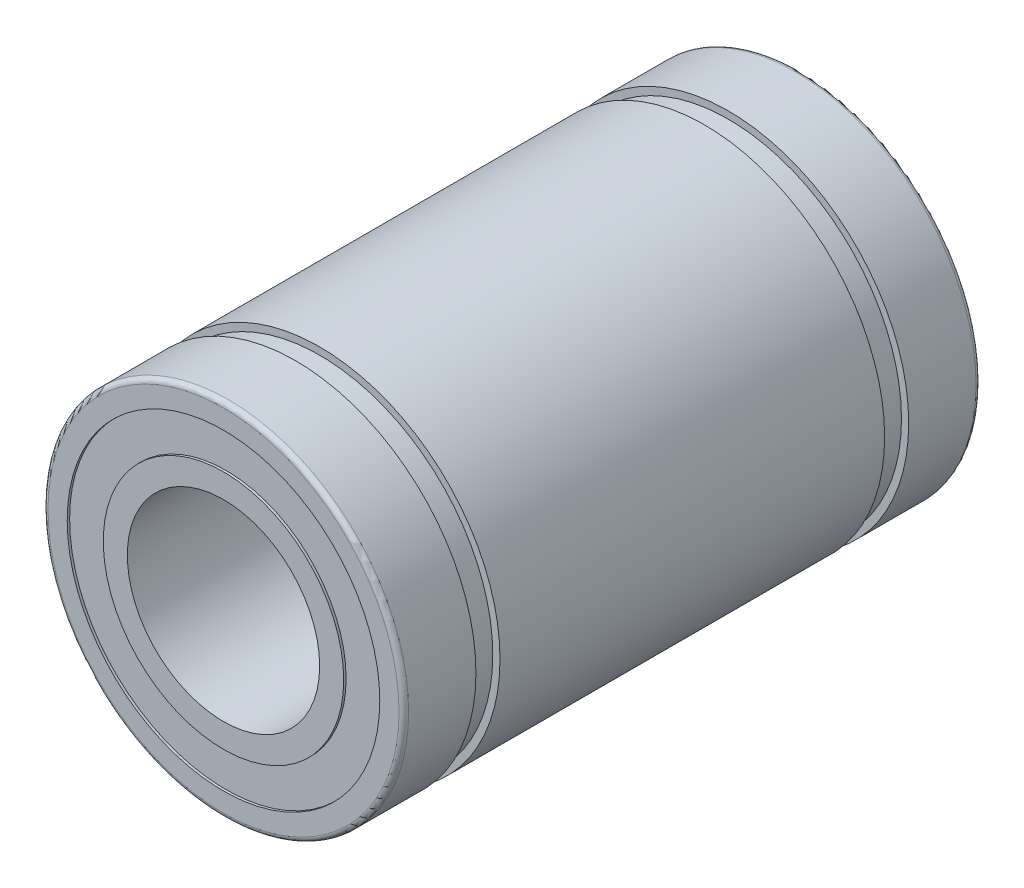
ISO-10303-21;
HEADER;
FILE_DESCRIPTION(('STEP AP214'),'2;1');
FILE_NAME('part.step','',(''),(''),'','','');
FILE_SCHEMA(('AUTOMOTIVE_DESIGN { 1 0 10303 214 1 1 1 1 }'));
ENDSEC;
DATA;
#1=APPLICATION_CONTEXT('core data for automotive mechanical design processes');
#2=APPLICATION_PROTOCOL_DEFINITION('international standard','automotive_design',2000,#1);
#3=PRODUCT_CONTEXT('',#1,'mechanical');
#4=PRODUCT('Part','Part','',(#3));
#5=PRODUCT_RELATED_PRODUCT_CATEGORY('part','',(#4));
#6=PRODUCT_DEFINITION_FORMATION('','',#4);
#7=PRODUCT_DEFINITION_CONTEXT('part definition',#1,'design');
#8=PRODUCT_DEFINITION('design','',#6,#7);
#9=PRODUCT_DEFINITION_SHAPE('','',#8);
#10=(LENGTH_UNIT() NAMED_UNIT(*) SI_UNIT(.MILLI.,.METRE.));
#11=(NAMED_UNIT(*) PLANE_ANGLE_UNIT() SI_UNIT($,.RADIAN.));
#12=(NAMED_UNIT(*) SI_UNIT($,.STERADIAN.) SOLID_ANGLE_UNIT());
#13=UNCERTAINTY_MEASURE_WITH_UNIT(LENGTH_MEASURE(1.E-05),#10,'distance_accuracy_value','');
#14=(GEOMETRIC_REPRESENTATION_CONTEXT(3) GLOBAL_UNCERTAINTY_ASSIGNED_CONTEXT((#13)) GLOBAL_UNIT_ASSIGNED_CONTEXT((#10,
#11,#12)) REPRESENTATION_CONTEXT('',''));
#15=CARTESIAN_POINT('',(0.,0.,0.));
#16=DIRECTION('',(0.,0.,1.));
#17=DIRECTION('',(1.,0.,0.));
#18=AXIS2_PLACEMENT_3D('',#15,#16,#17);
#19=CARTESIAN_POINT('',(0.,0.,0.));
#20=DIRECTION('',(0.,0.,1.));
#21=DIRECTION('',(1.,0.,0.));
#22=AXIS2_PLACEMENT_3D('',#19,#20,#21);
#23=CYLINDRICAL_SURFACE('',#22,7.5);
#24=CARTESIAN_POINT('',(0.,0.,-0.2));
#25=DIRECTION('',(0.,0.,-1.));
#26=DIRECTION('',(-1.,0.,0.));
#27=AXIS2_PLACEMENT_3D('',#24,#25,#26);
#28=CIRCLE('',#27,7.5);
#29=CARTESIAN_POINT('',(-7.5,0.,-0.2));
#30=VERTEX_POINT('',#29);
#31=EDGE_CURVE('E10',#30,#30,#28,.T.);
#32=ORIENTED_EDGE('',*,*,#31,.T.);
#33=EDGE_LOOP('',(#32));
#34=FACE_BOUND('',#33,.T.);
#35=CARTESIAN_POINT('',(0.,0.,-3.));
#36=DIRECTION('',(0.,0.,1.));
#37=DIRECTION('',(1.,0.,0.));
#38=AXIS2_PLACEMENT_3D('',#35,#36,#37);
#39=CIRCLE('',#38,7.5);
#40=CARTESIAN_POINT('',(7.5,0.,-3.));
#41=VERTEX_POINT('',#40);
#42=EDGE_CURVE('E140',#41,#41,#39,.T.);
#43=ORIENTED_EDGE('',*,*,#42,.T.);
#44=EDGE_LOOP('',(#43));
#45=FACE_BOUND('',#44,.T.);
#46=ADVANCED_FACE('F48',(#34,#45),#23,.T.);
#47=CARTESIAN_POINT('',(0.,7.5,0.));
#48=DIRECTION('',(0.,0.,-1.));
#49=DIRECTION('',(-1.,0.,0.));
#50=AXIS2_PLACEMENT_3D('',#47,#48,#49);
#51=PLANE('',#50);
#52=CARTESIAN_POINT('',(0.,0.,0.));
#53=DIRECTION('',(0.,0.,-1.));
#54=DIRECTION('',(-1.,0.,0.));
#55=AXIS2_PLACEMENT_3D('',#52,#53,#54);
#56=CIRCLE('',#55,7.3);
#57=CARTESIAN_POINT('',(-7.3,0.,0.));
#58=VERTEX_POINT('',#57);
#59=EDGE_CURVE('E56',#58,#58,#56,.F.);
#60=ORIENTED_EDGE('',*,*,#59,.T.);
#61=EDGE_LOOP('',(#60));
#62=FACE_BOUND('',#61,.T.);
#63=CARTESIAN_POINT('',(0.,0.,0.));
#64=DIRECTION('',(0.,0.,1.));
#65=DIRECTION('',(1.,0.,0.));
#66=AXIS2_PLACEMENT_3D('',#63,#64,#65);
#67=CIRCLE('',#66,6.5);
#68=CARTESIAN_POINT('',(6.5,0.,0.));
#69=VERTEX_POINT('',#68);
#70=EDGE_CURVE('E72',#69,#69,#67,.T.);
#71=ORIENTED_EDGE('',*,*,#70,.F.);
#72=EDGE_LOOP('',(#71));
#73=FACE_BOUND('',#72,.T.);
#74=ADVANCED_FACE('F202',(#62,#73),#51,.F.);
#75=CARTESIAN_POINT('',(0.,0.,0.));
#76=DIRECTION('',(0.,0.,1.));
#77=DIRECTION('',(1.,0.,0.));
#78=AXIS2_PLACEMENT_3D('',#75,#76,#77);
#79=CYLINDRICAL_SURFACE('',#78,6.5);
#80=CARTESIAN_POINT('',(0.,0.,-0.1));
#81=DIRECTION('',(0.,0.,1.));
#82=DIRECTION('',(1.,0.,0.));
#83=AXIS2_PLACEMENT_3D('',#80,#81,#82);
#84=CIRCLE('',#83,6.5);
#85=CARTESIAN_POINT('',(6.5,0.,-0.1));
#86=VERTEX_POINT('',#85);
#87=EDGE_CURVE('E76',#86,#86,#84,.T.);
#88=ORIENTED_EDGE('',*,*,#87,.F.);
#89=EDGE_LOOP('',(#88));
#90=FACE_BOUND('',#89,.T.);
#91=ORIENTED_EDGE('',*,*,#70,.T.);
#92=EDGE_LOOP('',(#91));
#93=FACE_BOUND('',#92,.T.);
#94=ADVANCED_FACE('F207',(#90,#93),#79,.F.);
#95=CARTESIAN_POINT('',(0.,6.5,-0.1));
#96=DIRECTION('',(0.,0.,-1.));
#97=DIRECTION('',(-1.,0.,0.));
#98=AXIS2_PLACEMENT_3D('',#95,#96,#97);
#99=PLANE('',#98);
#100=CARTESIAN_POINT('',(0.,0.,-0.1));
#101=DIRECTION('',(0.,0.,1.));
#102=DIRECTION('',(1.,0.,0.));
#103=AXIS2_PLACEMENT_3D('',#100,#101,#102);
#104=CIRCLE('',#103,5.);
#105=CARTESIAN_POINT('',(5.,0.,-0.1));
#106=VERTEX_POINT('',#105);
#107=EDGE_CURVE('E80',#106,#106,#104,.T.);
#108=ORIENTED_EDGE('',*,*,#107,.F.);
#109=EDGE_LOOP('',(#108));
#110=FACE_BOUND('',#109,.T.);
#111=ORIENTED_EDGE('',*,*,#87,.T.);
#112=EDGE_LOOP('',(#111));
#113=FACE_BOUND('',#112,.T.);
#114=ADVANCED_FACE('F259',(#110,#113),#99,.F.);
#115=CARTESIAN_POINT('',(0.,0.,0.));
#116=DIRECTION('',(0.,0.,1.));
#117=DIRECTION('',(1.,0.,0.));
#118=AXIS2_PLACEMENT_3D('',#115,#116,#117);
#119=CYLINDRICAL_SURFACE('',#118,5.);
#120=CARTESIAN_POINT('',(0.,0.,0.));
#121=DIRECTION('',(0.,0.,1.));
#122=DIRECTION('',(1.,0.,0.));
#123=AXIS2_PLACEMENT_3D('',#120,#121,#122);
#124=CIRCLE('',#123,5.);
#125=CARTESIAN_POINT('',(5.,0.,0.));
#126=VERTEX_POINT('',#125);
#127=EDGE_CURVE('E84',#126,#126,#124,.T.);
#128=ORIENTED_EDGE('',*,*,#127,.F.);
#129=EDGE_LOOP('',(#128));
#130=FACE_BOUND('',#129,.T.);
#131=ORIENTED_EDGE('',*,*,#107,.T.);
#132=EDGE_LOOP('',(#131));
#133=FACE_BOUND('',#132,.T.);
#134=ADVANCED_FACE('F253',(#130,#133),#119,.T.);
#135=CARTESIAN_POINT('',(0.,5.,0.));
#136=DIRECTION('',(0.,0.,-1.));
#137=DIRECTION('',(-1.,0.,0.));
#138=AXIS2_PLACEMENT_3D('',#135,#136,#137);
#139=PLANE('',#138);
#140=CARTESIAN_POINT('',(0.,0.,0.));
#141=DIRECTION('',(0.,0.,1.));
#142=DIRECTION('',(1.,0.,0.));
#143=AXIS2_PLACEMENT_3D('',#140,#141,#142);
#144=CIRCLE('',#143,4.);
#145=CARTESIAN_POINT('',(4.,0.,0.));
#146=VERTEX_POINT('',#145);
#147=EDGE_CURVE('E88',#146,#146,#144,.T.);
#148=ORIENTED_EDGE('',*,*,#147,.F.);
#149=EDGE_LOOP('',(#148));
#150=FACE_BOUND('',#149,.T.);
#151=ORIENTED_EDGE('',*,*,#127,.T.);
#152=EDGE_LOOP('',(#151));
#153=FACE_BOUND('',#152,.T.);
#154=ADVANCED_FACE('F247',(#150,#153),#139,.F.);
#155=CARTESIAN_POINT('',(0.,0.,0.));
#156=DIRECTION('',(0.,0.,1.));
#157=DIRECTION('',(1.,0.,0.));
#158=AXIS2_PLACEMENT_3D('',#155,#156,#157);
#159=CYLINDRICAL_SURFACE('',#158,4.);
#160=CARTESIAN_POINT('',(0.,0.,-24.));
#161=DIRECTION('',(0.,0.,1.));
#162=DIRECTION('',(1.,0.,0.));
#163=AXIS2_PLACEMENT_3D('',#160,#161,#162);
#164=CIRCLE('',#163,4.);
#165=CARTESIAN_POINT('',(4.,0.,-24.));
#166=VERTEX_POINT('',#165);
#167=EDGE_CURVE('E92',#166,#166,#164,.T.);
#168=ORIENTED_EDGE('',*,*,#167,.F.);
#169=EDGE_LOOP('',(#168));
#170=FACE_BOUND('',#169,.T.);
#171=ORIENTED_EDGE('',*,*,#147,.T.);
#172=EDGE_LOOP('',(#171));
#173=FACE_BOUND('',#172,.T.);
#174=ADVANCED_FACE('F241',(#170,#173),#159,.F.);
#175=CARTESIAN_POINT('',(0.,4.,-24.));
#176=DIRECTION('',(0.,0.,1.));
#177=DIRECTION('',(1.,0.,0.));
#178=AXIS2_PLACEMENT_3D('',#175,#176,#177);
#179=PLANE('',#178);
#180=CARTESIAN_POINT('',(0.,0.,-24.));
#181=DIRECTION('',(0.,0.,1.));
#182=DIRECTION('',(1.,0.,0.));
#183=AXIS2_PLACEMENT_3D('',#180,#181,#182);
#184=CIRCLE('',#183,5.);
#185=CARTESIAN_POINT('',(5.,0.,-24.));
#186=VERTEX_POINT('',#185);
#187=EDGE_CURVE('E96',#186,#186,#184,.T.);
#188=ORIENTED_EDGE('',*,*,#187,.F.);
#189=EDGE_LOOP('',(#188));
#190=FACE_BOUND('',#189,.T.);
#191=ORIENTED_EDGE('',*,*,#167,.T.);
#192=EDGE_LOOP('',(#191));
#193=FACE_BOUND('',#192,.T.);
#194=ADVANCED_FACE('F235',(#190,#193),#179,.F.);
#195=CARTESIAN_POINT('',(0.,0.,0.));
#196=DIRECTION('',(0.,0.,1.));
#197=DIRECTION('',(1.,0.,0.));
#198=AXIS2_PLACEMENT_3D('',#195,#196,#197);
#199=CYLINDRICAL_SURFACE('',#198,5.);
#200=CARTESIAN_POINT('',(0.,0.,-23.9));
#201=DIRECTION('',(0.,0.,1.));
#202=DIRECTION('',(1.,0.,0.));
#203=AXIS2_PLACEMENT_3D('',#200,#201,#202);
#204=CIRCLE('',#203,5.);
#205=CARTESIAN_POINT('',(5.,0.,-23.9));
#206=VERTEX_POINT('',#205);
#207=EDGE_CURVE('E100',#206,#206,#204,.T.);
#208=ORIENTED_EDGE('',*,*,#207,.F.);
#209=EDGE_LOOP('',(#208));
#210=FACE_BOUND('',#209,.T.);
#211=ORIENTED_EDGE('',*,*,#187,.T.);
#212=EDGE_LOOP('',(#211));
#213=FACE_BOUND('',#212,.T.);
#214=ADVANCED_FACE('F229',(#210,#213),#199,.T.);
#215=CARTESIAN_POINT('',(0.,5.,-23.9));
#216=DIRECTION('',(0.,0.,1.));
#217=DIRECTION('',(1.,0.,0.));
#218=AXIS2_PLACEMENT_3D('',#215,#216,#217);
#219=PLANE('',#218);
#220=CARTESIAN_POINT('',(0.,0.,-23.9));
#221=DIRECTION('',(0.,0.,1.));
#222=DIRECTION('',(1.,0.,0.));
#223=AXIS2_PLACEMENT_3D('',#220,#221,#222);
#224=CIRCLE('',#223,6.5);
#225=CARTESIAN_POINT('',(6.5,0.,-23.9));
#226=VERTEX_POINT('',#225);
#227=EDGE_CURVE('E104',#226,#226,#224,.T.);
#228=ORIENTED_EDGE('',*,*,#227,.F.);
#229=EDGE_LOOP('',(#228));
#230=FACE_BOUND('',#229,.T.);
#231=ORIENTED_EDGE('',*,*,#207,.T.);
#232=EDGE_LOOP('',(#231));
#233=FACE_BOUND('',#232,.T.);
#234=ADVANCED_FACE('F223',(#230,#233),#219,.F.);
#235=CARTESIAN_POINT('',(0.,0.,0.));
#236=DIRECTION('',(0.,0.,1.));
#237=DIRECTION('',(1.,0.,0.));
#238=AXIS2_PLACEMENT_3D('',#235,#236,#237);
#239=CYLINDRICAL_SURFACE('',#238,6.5);
#240=CARTESIAN_POINT('',(0.,0.,-24.));
#241=DIRECTION('',(0.,0.,1.));
#242=DIRECTION('',(1.,0.,0.));
#243=AXIS2_PLACEMENT_3D('',#240,#241,#242);
#244=CIRCLE('',#243,6.5);
#245=CARTESIAN_POINT('',(6.5,0.,-24.));
#246=VERTEX_POINT('',#245);
#247=EDGE_CURVE('E108',#246,#246,#244,.T.);
#248=ORIENTED_EDGE('',*,*,#247,.F.);
#249=EDGE_LOOP('',(#248));
#250=FACE_BOUND('',#249,.T.);
#251=ORIENTED_EDGE('',*,*,#227,.T.);
#252=EDGE_LOOP('',(#251));
#253=FACE_BOUND('',#252,.T.);
#254=ADVANCED_FACE('F198',(#250,#253),#239,.F.);
#255=CARTESIAN_POINT('',(0.,6.5,-24.));
#256=DIRECTION('',(0.,0.,1.));
#257=DIRECTION('',(1.,0.,0.));
#258=AXIS2_PLACEMENT_3D('',#255,#256,#257);
#259=PLANE('',#258);
#260=CARTESIAN_POINT('',(0.,0.,-24.));
#261=DIRECTION('',(0.,0.,1.));
#262=DIRECTION('',(1.,0.,0.));
#263=AXIS2_PLACEMENT_3D('',#260,#261,#262);
#264=CIRCLE('',#263,7.3);
#265=CARTESIAN_POINT('',(7.3,0.,-24.));
#266=VERTEX_POINT('',#265);
#267=EDGE_CURVE('E61',#266,#266,#264,.F.);
#268=ORIENTED_EDGE('',*,*,#267,.T.);
#269=EDGE_LOOP('',(#268));
#270=FACE_BOUND('',#269,.T.);
#271=ORIENTED_EDGE('',*,*,#247,.T.);
#272=EDGE_LOOP('',(#271));
#273=FACE_BOUND('',#272,.T.);
#274=ADVANCED_FACE('F191',(#270,#273),#259,.F.);
#275=CARTESIAN_POINT('',(0.,0.,0.));
#276=DIRECTION('',(0.,0.,1.));
#277=DIRECTION('',(1.,0.,0.));
#278=AXIS2_PLACEMENT_3D('',#275,#276,#277);
#279=CYLINDRICAL_SURFACE('',#278,7.5);
#280=CARTESIAN_POINT('',(0.,0.,-23.8));
#281=DIRECTION('',(0.,0.,1.));
#282=DIRECTION('',(1.,0.,0.));
#283=AXIS2_PLACEMENT_3D('',#280,#281,#282);
#284=CIRCLE('',#283,7.5);
#285=CARTESIAN_POINT('',(7.5,0.,-23.8));
#286=VERTEX_POINT('',#285);
#287=EDGE_CURVE('E66',#286,#286,#284,.T.);
#288=ORIENTED_EDGE('',*,*,#287,.T.);
#289=EDGE_LOOP('',(#288));
#290=FACE_BOUND('',#289,.T.);
#291=CARTESIAN_POINT('',(0.,0.,-21.));
#292=DIRECTION('',(0.,0.,1.));
#293=DIRECTION('',(1.,0.,0.));
#294=AXIS2_PLACEMENT_3D('',#291,#292,#293);
#295=CIRCLE('',#294,7.5);
#296=CARTESIAN_POINT('',(7.5,0.,-21.));
#297=VERTEX_POINT('',#296);
#298=EDGE_CURVE('E112',#297,#297,#295,.T.);
#299=ORIENTED_EDGE('',*,*,#298,.F.);
#300=EDGE_LOOP('',(#299));
#301=FACE_BOUND('',#300,.T.);
#302=ADVANCED_FACE('F186',(#290,#301),#279,.T.);
#303=CARTESIAN_POINT('',(0.,7.5,-21.));
#304=DIRECTION('',(0.,0.,-1.));
#305=DIRECTION('',(-1.,0.,0.));
#306=AXIS2_PLACEMENT_3D('',#303,#304,#305);
#307=PLANE('',#306);
#308=CARTESIAN_POINT('',(0.,0.,-21.));
#309=DIRECTION('',(0.,0.,1.));
#310=DIRECTION('',(1.,0.,0.));
#311=AXIS2_PLACEMENT_3D('',#308,#309,#310);
#312=CIRCLE('',#311,7.2);
#313=CARTESIAN_POINT('',(7.2,0.,-21.));
#314=VERTEX_POINT('',#313);
#315=EDGE_CURVE('E116',#314,#314,#312,.T.);
#316=ORIENTED_EDGE('',*,*,#315,.F.);
#317=EDGE_LOOP('',(#316));
#318=FACE_BOUND('',#317,.T.);
#319=ORIENTED_EDGE('',*,*,#298,.T.);
#320=EDGE_LOOP('',(#319));
#321=FACE_BOUND('',#320,.T.);
#322=ADVANCED_FACE('F180',(#318,#321),#307,.F.);
#323=CARTESIAN_POINT('',(0.,0.,0.));
#324=DIRECTION('',(0.,0.,1.));
#325=DIRECTION('',(1.,0.,0.));
#326=AXIS2_PLACEMENT_3D('',#323,#324,#325);
#327=CYLINDRICAL_SURFACE('',#326,7.2);
#328=CARTESIAN_POINT('',(0.,0.,-20.));
#329=DIRECTION('',(0.,0.,1.));
#330=DIRECTION('',(1.,0.,0.));
#331=AXIS2_PLACEMENT_3D('',#328,#329,#330);
#332=CIRCLE('',#331,7.2);
#333=CARTESIAN_POINT('',(7.2,0.,-20.));
#334=VERTEX_POINT('',#333);
#335=EDGE_CURVE('E120',#334,#334,#332,.T.);
#336=ORIENTED_EDGE('',*,*,#335,.F.);
#337=EDGE_LOOP('',(#336));
#338=FACE_BOUND('',#337,.T.);
#339=ORIENTED_EDGE('',*,*,#315,.T.);
#340=EDGE_LOOP('',(#339));
#341=FACE_BOUND('',#340,.T.);
#342=ADVANCED_FACE('F174',(#338,#341),#327,.T.);
#343=CARTESIAN_POINT('',(0.,7.2,-20.));
#344=DIRECTION('',(0.,0.,1.));
#345=DIRECTION('',(1.,0.,0.));
#346=AXIS2_PLACEMENT_3D('',#343,#344,#345);
#347=PLANE('',#346);
#348=CARTESIAN_POINT('',(0.,0.,-20.));
#349=DIRECTION('',(0.,0.,1.));
#350=DIRECTION('',(1.,0.,0.));
#351=AXIS2_PLACEMENT_3D('',#348,#349,#350);
#352=CIRCLE('',#351,7.50000000000001);
#353=CARTESIAN_POINT('',(7.50000000000001,0.,-20.));
#354=VERTEX_POINT('',#353);
#355=EDGE_CURVE('E124',#354,#354,#352,.T.);
#356=ORIENTED_EDGE('',*,*,#355,.F.);
#357=EDGE_LOOP('',(#356));
#358=FACE_BOUND('',#357,.T.);
#359=ORIENTED_EDGE('',*,*,#335,.T.);
#360=EDGE_LOOP('',(#359));
#361=FACE_BOUND('',#360,.T.);
#362=ADVANCED_FACE('F168',(#358,#361),#347,.F.);
#363=CARTESIAN_POINT('',(0.,0.,0.));
#364=DIRECTION('',(0.,0.,1.));
#365=DIRECTION('',(1.,0.,0.));
#366=AXIS2_PLACEMENT_3D('',#363,#364,#365);
#367=CYLINDRICAL_SURFACE('',#366,7.5);
#368=CARTESIAN_POINT('',(0.,0.,-4.));
#369=DIRECTION('',(0.,0.,1.));
#370=DIRECTION('',(1.,0.,0.));
#371=AXIS2_PLACEMENT_3D('',#368,#369,#370);
#372=CIRCLE('',#371,7.5);
#373=CARTESIAN_POINT('',(7.5,0.,-4.));
#374=VERTEX_POINT('',#373);
#375=EDGE_CURVE('E128',#374,#374,#372,.T.);
#376=ORIENTED_EDGE('',*,*,#375,.F.);
#377=EDGE_LOOP('',(#376));
#378=FACE_BOUND('',#377,.T.);
#379=ORIENTED_EDGE('',*,*,#355,.T.);
#380=EDGE_LOOP('',(#379));
#381=FACE_BOUND('',#380,.T.);
#382=ADVANCED_FACE('F162',(#378,#381),#367,.T.);
#383=CARTESIAN_POINT('',(0.,7.5,-4.));
#384=DIRECTION('',(0.,0.,-1.));
#385=DIRECTION('',(-1.,0.,0.));
#386=AXIS2_PLACEMENT_3D('',#383,#384,#385);
#387=PLANE('',#386);
#388=CARTESIAN_POINT('',(0.,0.,-4.));
#389=DIRECTION('',(0.,0.,1.));
#390=DIRECTION('',(1.,0.,0.));
#391=AXIS2_PLACEMENT_3D('',#388,#389,#390);
#392=CIRCLE('',#391,7.2);
#393=CARTESIAN_POINT('',(7.2,0.,-4.));
#394=VERTEX_POINT('',#393);
#395=EDGE_CURVE('E132',#394,#394,#392,.T.);
#396=ORIENTED_EDGE('',*,*,#395,.F.);
#397=EDGE_LOOP('',(#396));
#398=FACE_BOUND('',#397,.T.);
#399=ORIENTED_EDGE('',*,*,#375,.T.);
#400=EDGE_LOOP('',(#399));
#401=FACE_BOUND('',#400,.T.);
#402=ADVANCED_FACE('F156',(#398,#401),#387,.F.);
#403=CARTESIAN_POINT('',(0.,0.,0.));
#404=DIRECTION('',(0.,0.,1.));
#405=DIRECTION('',(1.,0.,0.));
#406=AXIS2_PLACEMENT_3D('',#403,#404,#405);
#407=CYLINDRICAL_SURFACE('',#406,7.2);
#408=CARTESIAN_POINT('',(0.,0.,-3.));
#409=DIRECTION('',(0.,0.,1.));
#410=DIRECTION('',(1.,0.,0.));
#411=AXIS2_PLACEMENT_3D('',#408,#409,#410);
#412=CIRCLE('',#411,7.2);
#413=CARTESIAN_POINT('',(7.2,0.,-3.));
#414=VERTEX_POINT('',#413);
#415=EDGE_CURVE('E136',#414,#414,#412,.T.);
#416=ORIENTED_EDGE('',*,*,#415,.F.);
#417=EDGE_LOOP('',(#416));
#418=FACE_BOUND('',#417,.T.);
#419=ORIENTED_EDGE('',*,*,#395,.T.);
#420=EDGE_LOOP('',(#419));
#421=FACE_BOUND('',#420,.T.);
#422=ADVANCED_FACE('F150',(#418,#421),#407,.T.);
#423=CARTESIAN_POINT('',(0.,7.2,-3.));
#424=DIRECTION('',(0.,0.,1.));
#425=DIRECTION('',(1.,0.,0.));
#426=AXIS2_PLACEMENT_3D('',#423,#424,#425);
#427=PLANE('',#426);
#428=ORIENTED_EDGE('',*,*,#42,.F.);
#429=EDGE_LOOP('',(#428));
#430=FACE_BOUND('',#429,.T.);
#431=ORIENTED_EDGE('',*,*,#415,.T.);
#432=EDGE_LOOP('',(#431));
#433=FACE_BOUND('',#432,.T.);
#434=ADVANCED_FACE('F146',(#430,#433),#427,.F.);
#435=CARTESIAN_POINT('',(0.,0.,-23.8));
#436=DIRECTION('',(0.,0.,1.));
#437=DIRECTION('',(1.,0.,0.));
#438=AXIS2_PLACEMENT_3D('',#435,#436,#437);
#439=TOROIDAL_SURFACE('',#438,7.3,0.2);
#440=ORIENTED_EDGE('',*,*,#267,.F.);
#441=EDGE_LOOP('',(#440));
#442=FACE_BOUND('',#441,.T.);
#443=ORIENTED_EDGE('',*,*,#287,.F.);
#444=EDGE_LOOP('',(#443));
#445=FACE_BOUND('',#444,.T.);
#446=ADVANCED_FACE('F149',(#442,#445),#439,.T.);
#447=CARTESIAN_POINT('',(0.,0.,-0.2));
#448=DIRECTION('',(0.,0.,-1.));
#449=DIRECTION('',(-1.,0.,0.));
#450=AXIS2_PLACEMENT_3D('',#447,#448,#449);
#451=TOROIDAL_SURFACE('',#450,7.3,0.2);
#452=ORIENTED_EDGE('',*,*,#31,.F.);
#453=EDGE_LOOP('',(#452));
#454=FACE_BOUND('',#453,.T.);
#455=ORIENTED_EDGE('',*,*,#59,.F.);
#456=EDGE_LOOP('',(#455));
#457=FACE_BOUND('',#456,.T.);
#458=ADVANCED_FACE('F50',(#454,#457),#451,.T.);
#459=CLOSED_SHELL('',(#46,#74,#94,#114,#134,#154,#174,#194,#214,#234,#254,#274,#302,#322,#342,
#362,#382,#402,#422,#434,#446,#458));
#460=MANIFOLD_SOLID_BREP('B2',#459);
#461=ADVANCED_BREP_SHAPE_REPRESENTATION('',(#18,#460),#14);
#462=SHAPE_DEFINITION_REPRESENTATION(#9,#461);
ENDSEC;
END-ISO-10303-21;
